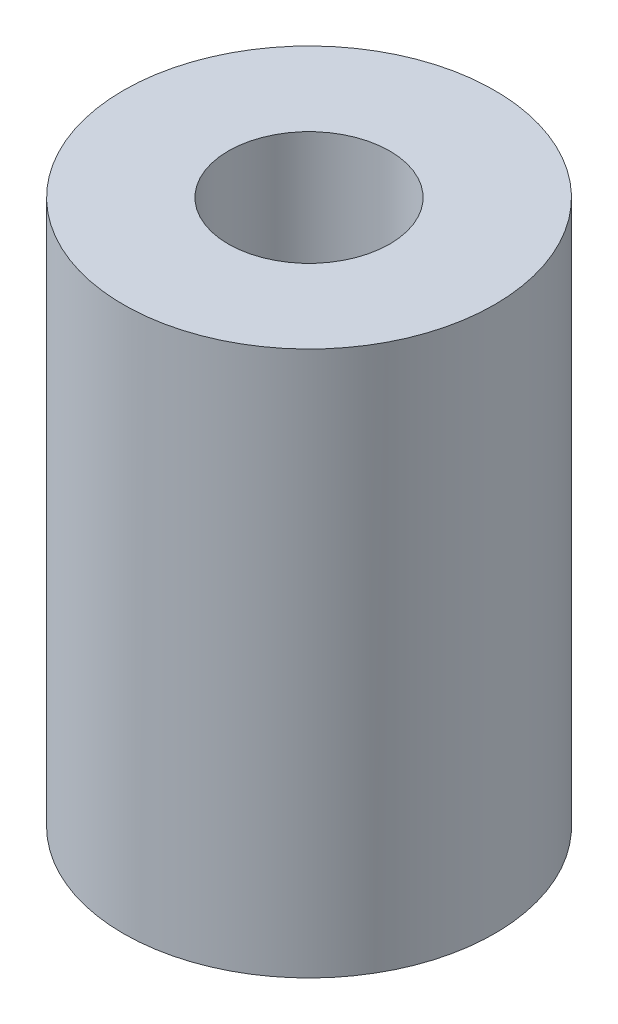
ISO-10303-21;
HEADER;
FILE_DESCRIPTION(('STEP AP214'),'2;1');
FILE_NAME('part.step','',(''),(''),'','','');
FILE_SCHEMA(('AUTOMOTIVE_DESIGN { 1 0 10303 214 1 1 1 1 }'));
ENDSEC;
DATA;
#1=APPLICATION_CONTEXT('core data for automotive mechanical design processes');
#2=APPLICATION_PROTOCOL_DEFINITION('international standard','automotive_design',2000,#1);
#3=PRODUCT_CONTEXT('',#1,'mechanical');
#4=PRODUCT('Part','Part','',(#3));
#5=PRODUCT_RELATED_PRODUCT_CATEGORY('part','',(#4));
#6=PRODUCT_DEFINITION_FORMATION('','',#4);
#7=PRODUCT_DEFINITION_CONTEXT('part definition',#1,'design');
#8=PRODUCT_DEFINITION('design','',#6,#7);
#9=PRODUCT_DEFINITION_SHAPE('','',#8);
#10=(LENGTH_UNIT() NAMED_UNIT(*) SI_UNIT(.MILLI.,.METRE.));
#11=(NAMED_UNIT(*) PLANE_ANGLE_UNIT() SI_UNIT($,.RADIAN.));
#12=(NAMED_UNIT(*) SI_UNIT($,.STERADIAN.) SOLID_ANGLE_UNIT());
#13=UNCERTAINTY_MEASURE_WITH_UNIT(LENGTH_MEASURE(1.E-05),#10,'distance_accuracy_value','');
#14=(GEOMETRIC_REPRESENTATION_CONTEXT(3) GLOBAL_UNCERTAINTY_ASSIGNED_CONTEXT((#13)) GLOBAL_UNIT_ASSIGNED_CONTEXT((#10,
#11,#12)) REPRESENTATION_CONTEXT('',''));
#15=CARTESIAN_POINT('',(0.,0.,0.));
#16=DIRECTION('',(0.,0.,1.));
#17=DIRECTION('',(1.,0.,0.));
#18=AXIS2_PLACEMENT_3D('',#15,#16,#17);
#19=CARTESIAN_POINT('',(0.,26.5107647738325,0.));
#20=DIRECTION('',(0.,-1.,0.));
#21=DIRECTION('',(0.,0.,-1.));
#22=AXIS2_PLACEMENT_3D('',#19,#20,#21);
#23=CYLINDRICAL_SURFACE('',#22,4.6);
#24=CARTESIAN_POINT('',(0.,0.,0.));
#25=DIRECTION('',(0.,1.,0.));
#26=DIRECTION('',(0.,0.,1.));
#27=AXIS2_PLACEMENT_3D('',#24,#25,#26);
#28=CIRCLE('',#27,4.6);
#29=CARTESIAN_POINT('',(0.,0.,4.6));
#30=VERTEX_POINT('',#29);
#31=EDGE_CURVE('E36',#30,#30,#28,.T.);
#32=ORIENTED_EDGE('',*,*,#31,.T.);
#33=EDGE_LOOP('',(#32));
#34=FACE_BOUND('',#33,.T.);
#35=CARTESIAN_POINT('',(0.,13.5000000000001,0.));
#36=DIRECTION('',(0.,1.,0.));
#37=DIRECTION('',(-1.,0.,0.));
#38=AXIS2_PLACEMENT_3D('',#35,#36,#37);
#39=CIRCLE('',#38,4.6);
#40=CARTESIAN_POINT('',(-4.6,13.5000000000001,0.));
#41=VERTEX_POINT('',#40);
#42=EDGE_CURVE('E10',#41,#41,#39,.T.);
#43=ORIENTED_EDGE('',*,*,#42,.F.);
#44=EDGE_LOOP('',(#43));
#45=FACE_BOUND('',#44,.T.);
#46=ADVANCED_FACE('F29',(#34,#45),#23,.T.);
#47=CARTESIAN_POINT('',(0.,0.,0.));
#48=DIRECTION('',(0.,1.,0.));
#49=DIRECTION('',(0.,0.,1.));
#50=AXIS2_PLACEMENT_3D('',#47,#48,#49);
#51=PLANE('',#50);
#52=ORIENTED_EDGE('',*,*,#31,.F.);
#53=EDGE_LOOP('',(#52));
#54=FACE_BOUND('',#53,.T.);
#55=CARTESIAN_POINT('',(0.,0.,0.));
#56=DIRECTION('',(0.,1.,0.));
#57=DIRECTION('',(0.,0.,1.));
#58=AXIS2_PLACEMENT_3D('',#55,#56,#57);
#59=CIRCLE('',#58,2.);
#60=CARTESIAN_POINT('',(0.,0.,2.));
#61=VERTEX_POINT('',#60);
#62=EDGE_CURVE('E41',#61,#61,#59,.T.);
#63=ORIENTED_EDGE('',*,*,#62,.T.);
#64=EDGE_LOOP('',(#63));
#65=FACE_BOUND('',#64,.T.);
#66=ADVANCED_FACE('F57',(#54,#65),#51,.F.);
#67=CARTESIAN_POINT('',(0.,26.5107647738325,0.));
#68=DIRECTION('',(0.,-1.,0.));
#69=DIRECTION('',(0.,0.,-1.));
#70=AXIS2_PLACEMENT_3D('',#67,#68,#69);
#71=CYLINDRICAL_SURFACE('',#70,2.);
#72=ORIENTED_EDGE('',*,*,#62,.F.);
#73=EDGE_LOOP('',(#72));
#74=FACE_BOUND('',#73,.T.);
#75=CARTESIAN_POINT('',(0.,13.5000000000001,0.));
#76=DIRECTION('',(0.,1.,0.));
#77=DIRECTION('',(-1.,0.,0.));
#78=AXIS2_PLACEMENT_3D('',#75,#76,#77);
#79=CIRCLE('',#78,2.);
#80=CARTESIAN_POINT('',(-2.,13.5000000000001,0.));
#81=VERTEX_POINT('',#80);
#82=EDGE_CURVE('E32',#81,#81,#79,.T.);
#83=ORIENTED_EDGE('',*,*,#82,.T.);
#84=EDGE_LOOP('',(#83));
#85=FACE_BOUND('',#84,.T.);
#86=ADVANCED_FACE('F49',(#74,#85),#71,.F.);
#87=CARTESIAN_POINT('',(-9.8137011187627,13.5000000000001,20.247006454081));
#88=DIRECTION('',(0.,1.,0.));
#89=DIRECTION('',(0.899866953514711,0.,0.436164494167227));
#90=AXIS2_PLACEMENT_3D('',#87,#88,#89);
#91=PLANE('',#90);
#92=ORIENTED_EDGE('',*,*,#82,.F.);
#93=EDGE_LOOP('',(#92));
#94=FACE_BOUND('',#93,.T.);
#95=ORIENTED_EDGE('',*,*,#42,.T.);
#96=EDGE_LOOP('',(#95));
#97=FACE_BOUND('',#96,.T.);
#98=ADVANCED_FACE('F51',(#94,#97),#91,.T.);
#99=CLOSED_SHELL('',(#46,#66,#86,#98));
#100=MANIFOLD_SOLID_BREP('B2',#99);
#101=ADVANCED_BREP_SHAPE_REPRESENTATION('',(#18,#100),#14);
#102=SHAPE_DEFINITION_REPRESENTATION(#9,#101);
ENDSEC;
END-ISO-10303-21;
